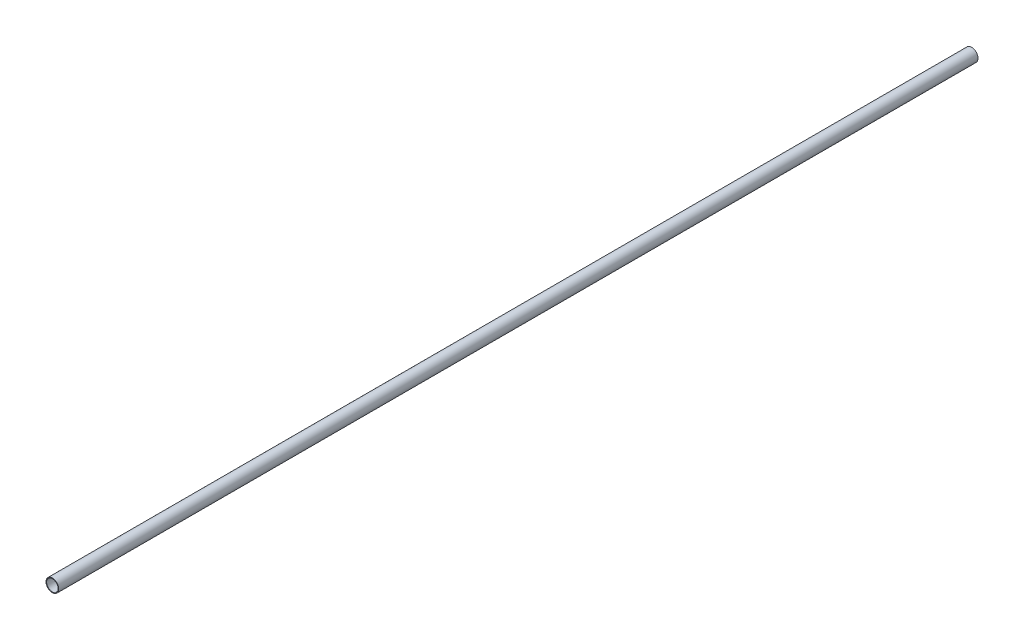
ISO-10303-21;
HEADER;
FILE_DESCRIPTION(('STEP AP214'),'2;1');
FILE_NAME('part.step','',(''),(''),'','','');
FILE_SCHEMA(('AUTOMOTIVE_DESIGN { 1 0 10303 214 1 1 1 1 }'));
ENDSEC;
DATA;
#1=APPLICATION_CONTEXT('core data for automotive mechanical design processes');
#2=APPLICATION_PROTOCOL_DEFINITION('international standard','automotive_design',2000,#1);
#3=PRODUCT_CONTEXT('',#1,'mechanical');
#4=PRODUCT('Part','Part','',(#3));
#5=PRODUCT_RELATED_PRODUCT_CATEGORY('part','',(#4));
#6=PRODUCT_DEFINITION_FORMATION('','',#4);
#7=PRODUCT_DEFINITION_CONTEXT('part definition',#1,'design');
#8=PRODUCT_DEFINITION('design','',#6,#7);
#9=PRODUCT_DEFINITION_SHAPE('','',#8);
#10=(LENGTH_UNIT() NAMED_UNIT(*) SI_UNIT(.MILLI.,.METRE.));
#11=(NAMED_UNIT(*) PLANE_ANGLE_UNIT() SI_UNIT($,.RADIAN.));
#12=(NAMED_UNIT(*) SI_UNIT($,.STERADIAN.) SOLID_ANGLE_UNIT());
#13=UNCERTAINTY_MEASURE_WITH_UNIT(LENGTH_MEASURE(1.E-05),#10,'distance_accuracy_value','');
#14=(GEOMETRIC_REPRESENTATION_CONTEXT(3) GLOBAL_UNCERTAINTY_ASSIGNED_CONTEXT((#13)) GLOBAL_UNIT_ASSIGNED_CONTEXT((#10,
#11,#12)) REPRESENTATION_CONTEXT('',''));
#15=CARTESIAN_POINT('',(0.,0.,0.));
#16=DIRECTION('',(0.,0.,1.));
#17=DIRECTION('',(1.,0.,0.));
#18=AXIS2_PLACEMENT_3D('',#15,#16,#17);
#19=CARTESIAN_POINT('',(0.,0.,914.4));
#20=DIRECTION('',(0.,0.,1.));
#21=DIRECTION('',(1.,0.,0.));
#22=AXIS2_PLACEMENT_3D('',#19,#20,#21);
#23=PLANE('',#22);
#24=CARTESIAN_POINT('',(0.,0.,914.4));
#25=DIRECTION('',(0.,0.,1.));
#26=DIRECTION('',(1.,0.,0.));
#27=AXIS2_PLACEMENT_3D('',#24,#25,#26);
#28=CIRCLE('',#27,12.7);
#29=CARTESIAN_POINT('',(12.7,0.,914.4));
#30=VERTEX_POINT('',#29);
#31=EDGE_CURVE('E10',#30,#30,#28,.T.);
#32=ORIENTED_EDGE('',*,*,#31,.T.);
#33=EDGE_LOOP('',(#32));
#34=FACE_BOUND('',#33,.T.);
#35=CARTESIAN_POINT('',(0.,0.,914.4));
#36=DIRECTION('',(0.,0.,1.));
#37=DIRECTION('',(1.,0.,0.));
#38=AXIS2_PLACEMENT_3D('',#35,#36,#37);
#39=CIRCLE('',#38,11.4554);
#40=CARTESIAN_POINT('',(11.4554,0.,914.4));
#41=VERTEX_POINT('',#40);
#42=EDGE_CURVE('E37',#41,#41,#39,.T.);
#43=ORIENTED_EDGE('',*,*,#42,.F.);
#44=EDGE_LOOP('',(#43));
#45=FACE_BOUND('',#44,.T.);
#46=ADVANCED_FACE('F30',(#34,#45),#23,.T.);
#47=CARTESIAN_POINT('',(0.,0.,914.4));
#48=DIRECTION('',(0.,0.,-1.));
#49=DIRECTION('',(-1.,0.,0.));
#50=AXIS2_PLACEMENT_3D('',#47,#48,#49);
#51=CYLINDRICAL_SURFACE('',#50,12.7);
#52=ORIENTED_EDGE('',*,*,#31,.F.);
#53=EDGE_LOOP('',(#52));
#54=FACE_BOUND('',#53,.T.);
#55=CARTESIAN_POINT('',(0.,0.,-914.4));
#56=DIRECTION('',(0.,0.,1.));
#57=DIRECTION('',(1.,0.,0.));
#58=AXIS2_PLACEMENT_3D('',#55,#56,#57);
#59=CIRCLE('',#58,12.7);
#60=CARTESIAN_POINT('',(12.7,0.,-914.4));
#61=VERTEX_POINT('',#60);
#62=EDGE_CURVE('E41',#61,#61,#59,.T.);
#63=ORIENTED_EDGE('',*,*,#62,.T.);
#64=EDGE_LOOP('',(#63));
#65=FACE_BOUND('',#64,.T.);
#66=ADVANCED_FACE('F32',(#54,#65),#51,.T.);
#67=CARTESIAN_POINT('',(0.,0.,914.4));
#68=DIRECTION('',(0.,0.,-1.));
#69=DIRECTION('',(-1.,0.,0.));
#70=AXIS2_PLACEMENT_3D('',#67,#68,#69);
#71=CYLINDRICAL_SURFACE('',#70,11.4554);
#72=ORIENTED_EDGE('',*,*,#42,.T.);
#73=EDGE_LOOP('',(#72));
#74=FACE_BOUND('',#73,.T.);
#75=CARTESIAN_POINT('',(0.,0.,-914.4));
#76=DIRECTION('',(0.,0.,1.));
#77=DIRECTION('',(1.,0.,0.));
#78=AXIS2_PLACEMENT_3D('',#75,#76,#77);
#79=CIRCLE('',#78,11.4554);
#80=CARTESIAN_POINT('',(11.4554,0.,-914.4));
#81=VERTEX_POINT('',#80);
#82=EDGE_CURVE('E45',#81,#81,#79,.T.);
#83=ORIENTED_EDGE('',*,*,#82,.F.);
#84=EDGE_LOOP('',(#83));
#85=FACE_BOUND('',#84,.T.);
#86=ADVANCED_FACE('F54',(#74,#85),#71,.F.);
#87=CARTESIAN_POINT('',(0.,0.,-914.4));
#88=DIRECTION('',(0.,0.,1.));
#89=DIRECTION('',(1.,0.,0.));
#90=AXIS2_PLACEMENT_3D('',#87,#88,#89);
#91=PLANE('',#90);
#92=ORIENTED_EDGE('',*,*,#82,.T.);
#93=EDGE_LOOP('',(#92));
#94=FACE_BOUND('',#93,.T.);
#95=ORIENTED_EDGE('',*,*,#62,.F.);
#96=EDGE_LOOP('',(#95));
#97=FACE_BOUND('',#96,.T.);
#98=ADVANCED_FACE('F51',(#94,#97),#91,.F.);
#99=CLOSED_SHELL('',(#46,#66,#86,#98));
#100=MANIFOLD_SOLID_BREP('B2',#99);
#101=ADVANCED_BREP_SHAPE_REPRESENTATION('',(#18,#100),#14);
#102=SHAPE_DEFINITION_REPRESENTATION(#9,#101);
ENDSEC;
END-ISO-10303-21;
